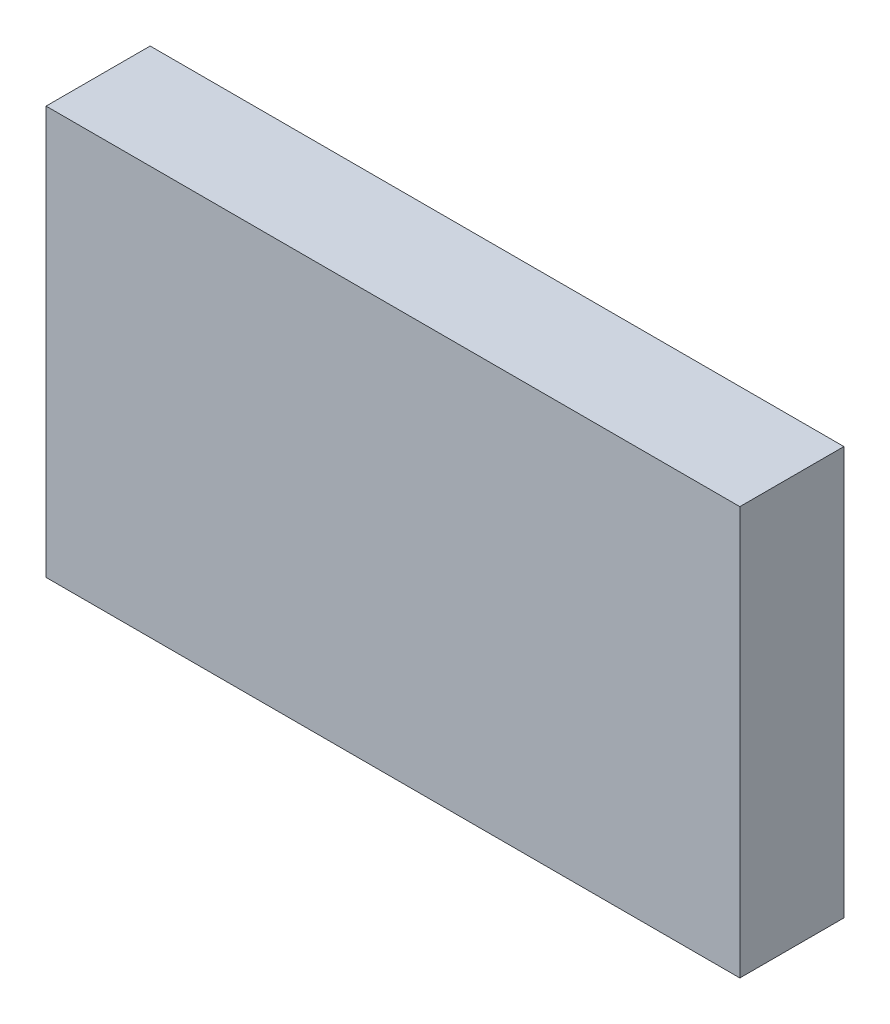
ISO-10303-21;
HEADER;
FILE_DESCRIPTION(('STEP AP214'),'2;1');
FILE_NAME('part.step','',(''),(''),'','','');
FILE_SCHEMA(('AUTOMOTIVE_DESIGN { 1 0 10303 214 1 1 1 1 }'));
ENDSEC;
DATA;
#1=APPLICATION_CONTEXT('core data for automotive mechanical design processes');
#2=APPLICATION_PROTOCOL_DEFINITION('international standard','automotive_design',2000,#1);
#3=PRODUCT_CONTEXT('',#1,'mechanical');
#4=PRODUCT('Part','Part','',(#3));
#5=PRODUCT_RELATED_PRODUCT_CATEGORY('part','',(#4));
#6=PRODUCT_DEFINITION_FORMATION('','',#4);
#7=PRODUCT_DEFINITION_CONTEXT('part definition',#1,'design');
#8=PRODUCT_DEFINITION('design','',#6,#7);
#9=PRODUCT_DEFINITION_SHAPE('','',#8);
#10=(LENGTH_UNIT() NAMED_UNIT(*) SI_UNIT(.MILLI.,.METRE.));
#11=(NAMED_UNIT(*) PLANE_ANGLE_UNIT() SI_UNIT($,.RADIAN.));
#12=(NAMED_UNIT(*) SI_UNIT($,.STERADIAN.) SOLID_ANGLE_UNIT());
#13=UNCERTAINTY_MEASURE_WITH_UNIT(LENGTH_MEASURE(1.E-05),#10,'distance_accuracy_value','');
#14=(GEOMETRIC_REPRESENTATION_CONTEXT(3) GLOBAL_UNCERTAINTY_ASSIGNED_CONTEXT((#13)) GLOBAL_UNIT_ASSIGNED_CONTEXT((#10,
#11,#12)) REPRESENTATION_CONTEXT('',''));
#15=CARTESIAN_POINT('',(0.,0.,0.));
#16=DIRECTION('',(0.,0.,1.));
#17=DIRECTION('',(1.,0.,0.));
#18=AXIS2_PLACEMENT_3D('',#15,#16,#17);
#19=CARTESIAN_POINT('',(10.,-5.88414634146341,3.));
#20=DIRECTION('',(-1.,0.,0.));
#21=DIRECTION('',(0.,0.,1.));
#22=AXIS2_PLACEMENT_3D('',#19,#20,#21);
#23=PLANE('',#22);
#24=DIRECTION('',(0.,1.,0.));
#25=VECTOR('',#24,1.);
#26=CARTESIAN_POINT('',(10.,-5.88414634146341,0.));
#27=LINE('',#26,#25);
#28=CARTESIAN_POINT('',(10.,-5.88414634146341,0.));
#29=VERTEX_POINT('',#28);
#30=CARTESIAN_POINT('',(10.,5.88414634146341,0.));
#31=VERTEX_POINT('',#30);
#32=EDGE_CURVE('E107',#29,#31,#27,.T.);
#33=ORIENTED_EDGE('',*,*,#32,.T.);
#34=DIRECTION('',(0.,0.,-1.));
#35=VECTOR('',#34,1.);
#36=CARTESIAN_POINT('',(10.,5.88414634146341,3.));
#37=LINE('',#36,#35);
#38=CARTESIAN_POINT('',(10.,5.88414634146341,3.));
#39=VERTEX_POINT('',#38);
#40=EDGE_CURVE('E11',#39,#31,#37,.T.);
#41=ORIENTED_EDGE('',*,*,#40,.F.);
#42=DIRECTION('',(0.,1.,0.));
#43=VECTOR('',#42,1.);
#44=CARTESIAN_POINT('',(10.,-5.88414634146341,3.));
#45=LINE('',#44,#43);
#46=CARTESIAN_POINT('',(10.,-5.88414634146341,3.));
#47=VERTEX_POINT('',#46);
#48=EDGE_CURVE('E91',#47,#39,#45,.T.);
#49=ORIENTED_EDGE('',*,*,#48,.F.);
#50=DIRECTION('',(0.,0.,-1.));
#51=VECTOR('',#50,1.);
#52=CARTESIAN_POINT('',(10.,-5.88414634146341,3.));
#53=LINE('',#52,#51);
#54=EDGE_CURVE('E103',#47,#29,#53,.T.);
#55=ORIENTED_EDGE('',*,*,#54,.T.);
#56=EDGE_LOOP('',(#33,#41,#49,#55));
#57=FACE_BOUND('',#56,.T.);
#58=ADVANCED_FACE('F39',(#57),#23,.F.);
#59=CARTESIAN_POINT('',(-10.,5.88414634146341,3.));
#60=DIRECTION('',(0.,-1.,0.));
#61=DIRECTION('',(0.,0.,-1.));
#62=AXIS2_PLACEMENT_3D('',#59,#60,#61);
#63=PLANE('',#62);
#64=DIRECTION('',(-1.,0.,0.));
#65=VECTOR('',#64,1.);
#66=CARTESIAN_POINT('',(-10.,5.88414634146341,0.));
#67=LINE('',#66,#65);
#68=CARTESIAN_POINT('',(-10.,5.88414634146341,0.));
#69=VERTEX_POINT('',#68);
#70=EDGE_CURVE('E96',#31,#69,#67,.T.);
#71=ORIENTED_EDGE('',*,*,#70,.T.);
#72=DIRECTION('',(0.,0.,-1.));
#73=VECTOR('',#72,1.);
#74=CARTESIAN_POINT('',(-10.,5.88414634146341,3.));
#75=LINE('',#74,#73);
#76=CARTESIAN_POINT('',(-10.,5.88414634146341,3.));
#77=VERTEX_POINT('',#76);
#78=EDGE_CURVE('E48',#77,#69,#75,.T.);
#79=ORIENTED_EDGE('',*,*,#78,.F.);
#80=DIRECTION('',(-1.,0.,0.));
#81=VECTOR('',#80,1.);
#82=CARTESIAN_POINT('',(-10.,5.88414634146341,3.));
#83=LINE('',#82,#81);
#84=EDGE_CURVE('E86',#39,#77,#83,.T.);
#85=ORIENTED_EDGE('',*,*,#84,.F.);
#86=ORIENTED_EDGE('',*,*,#40,.T.);
#87=EDGE_LOOP('',(#71,#79,#85,#86));
#88=FACE_BOUND('',#87,.T.);
#89=ADVANCED_FACE('F95',(#88),#63,.F.);
#90=CARTESIAN_POINT('',(-10.,-5.88414634146341,3.));
#91=DIRECTION('',(1.,0.,0.));
#92=DIRECTION('',(0.,0.,-1.));
#93=AXIS2_PLACEMENT_3D('',#90,#91,#92);
#94=PLANE('',#93);
#95=DIRECTION('',(0.,-1.,0.));
#96=VECTOR('',#95,1.);
#97=CARTESIAN_POINT('',(-10.,-5.88414634146341,0.));
#98=LINE('',#97,#96);
#99=CARTESIAN_POINT('',(-10.,-5.88414634146341,0.));
#100=VERTEX_POINT('',#99);
#101=EDGE_CURVE('E73',#69,#100,#98,.T.);
#102=ORIENTED_EDGE('',*,*,#101,.T.);
#103=DIRECTION('',(0.,0.,-1.));
#104=VECTOR('',#103,1.);
#105=CARTESIAN_POINT('',(-10.,-5.88414634146341,3.));
#106=LINE('',#105,#104);
#107=CARTESIAN_POINT('',(-10.,-5.88414634146341,3.));
#108=VERTEX_POINT('',#107);
#109=EDGE_CURVE('E98',#108,#100,#106,.T.);
#110=ORIENTED_EDGE('',*,*,#109,.F.);
#111=DIRECTION('',(0.,-1.,0.));
#112=VECTOR('',#111,1.);
#113=CARTESIAN_POINT('',(-10.,-5.88414634146341,3.));
#114=LINE('',#113,#112);
#115=EDGE_CURVE('E89',#77,#108,#114,.T.);
#116=ORIENTED_EDGE('',*,*,#115,.F.);
#117=ORIENTED_EDGE('',*,*,#78,.T.);
#118=EDGE_LOOP('',(#102,#110,#116,#117));
#119=FACE_BOUND('',#118,.T.);
#120=ADVANCED_FACE('F99',(#119),#94,.F.);
#121=CARTESIAN_POINT('',(-10.,-5.88414634146341,3.));
#122=DIRECTION('',(0.,1.,0.));
#123=DIRECTION('',(0.,0.,1.));
#124=AXIS2_PLACEMENT_3D('',#121,#122,#123);
#125=PLANE('',#124);
#126=DIRECTION('',(1.,0.,0.));
#127=VECTOR('',#126,1.);
#128=CARTESIAN_POINT('',(-10.,-5.88414634146341,0.));
#129=LINE('',#128,#127);
#130=EDGE_CURVE('E79',#100,#29,#129,.T.);
#131=ORIENTED_EDGE('',*,*,#130,.T.);
#132=ORIENTED_EDGE('',*,*,#54,.F.);
#133=DIRECTION('',(1.,0.,0.));
#134=VECTOR('',#133,1.);
#135=CARTESIAN_POINT('',(-10.,-5.88414634146341,3.));
#136=LINE('',#135,#134);
#137=EDGE_CURVE('E56',#108,#47,#136,.T.);
#138=ORIENTED_EDGE('',*,*,#137,.F.);
#139=ORIENTED_EDGE('',*,*,#109,.T.);
#140=EDGE_LOOP('',(#131,#132,#138,#139));
#141=FACE_BOUND('',#140,.T.);
#142=ADVANCED_FACE('F120',(#141),#125,.F.);
#143=CARTESIAN_POINT('',(0.,0.,3.));
#144=DIRECTION('',(0.,0.,-1.));
#145=DIRECTION('',(-1.,0.,0.));
#146=AXIS2_PLACEMENT_3D('',#143,#144,#145);
#147=PLANE('',#146);
#148=ORIENTED_EDGE('',*,*,#48,.T.);
#149=ORIENTED_EDGE('',*,*,#84,.T.);
#150=ORIENTED_EDGE('',*,*,#115,.T.);
#151=ORIENTED_EDGE('',*,*,#137,.T.);
#152=EDGE_LOOP('',(#148,#149,#150,#151));
#153=FACE_BOUND('',#152,.T.);
#154=ADVANCED_FACE('F87',(#153),#147,.F.);
#155=CARTESIAN_POINT('',(0.,0.,0.));
#156=DIRECTION('',(0.,0.,-1.));
#157=DIRECTION('',(-1.,0.,0.));
#158=AXIS2_PLACEMENT_3D('',#155,#156,#157);
#159=PLANE('',#158);
#160=ORIENTED_EDGE('',*,*,#32,.F.);
#161=ORIENTED_EDGE('',*,*,#130,.F.);
#162=ORIENTED_EDGE('',*,*,#101,.F.);
#163=ORIENTED_EDGE('',*,*,#70,.F.);
#164=EDGE_LOOP('',(#160,#161,#162,#163));
#165=FACE_BOUND('',#164,.T.);
#166=ADVANCED_FACE('F123',(#165),#159,.T.);
#167=CLOSED_SHELL('',(#58,#89,#120,#142,#154,#166));
#168=MANIFOLD_SOLID_BREP('B2',#167);
#169=ADVANCED_BREP_SHAPE_REPRESENTATION('',(#18,#168),#14);
#170=SHAPE_DEFINITION_REPRESENTATION(#9,#169);
ENDSEC;
END-ISO-10303-21;
